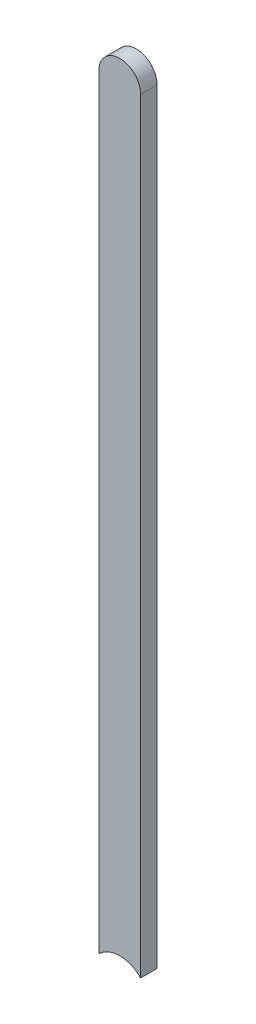
ISO-10303-21;
HEADER;
FILE_DESCRIPTION(('STEP AP214'),'2;1');
FILE_NAME('part.step','',(''),(''),'','','');
FILE_SCHEMA(('AUTOMOTIVE_DESIGN { 1 0 10303 214 1 1 1 1 }'));
ENDSEC;
DATA;
#1=APPLICATION_CONTEXT('core data for automotive mechanical design processes');
#2=APPLICATION_PROTOCOL_DEFINITION('international standard','automotive_design',2000,#1);
#3=PRODUCT_CONTEXT('',#1,'mechanical');
#4=PRODUCT('Part','Part','',(#3));
#5=PRODUCT_RELATED_PRODUCT_CATEGORY('part','',(#4));
#6=PRODUCT_DEFINITION_FORMATION('','',#4);
#7=PRODUCT_DEFINITION_CONTEXT('part definition',#1,'design');
#8=PRODUCT_DEFINITION('design','',#6,#7);
#9=PRODUCT_DEFINITION_SHAPE('','',#8);
#10=(LENGTH_UNIT() NAMED_UNIT(*) SI_UNIT(.MILLI.,.METRE.));
#11=(NAMED_UNIT(*) PLANE_ANGLE_UNIT() SI_UNIT($,.RADIAN.));
#12=(NAMED_UNIT(*) SI_UNIT($,.STERADIAN.) SOLID_ANGLE_UNIT());
#13=UNCERTAINTY_MEASURE_WITH_UNIT(LENGTH_MEASURE(1.E-05),#10,'distance_accuracy_value','');
#14=(GEOMETRIC_REPRESENTATION_CONTEXT(3) GLOBAL_UNCERTAINTY_ASSIGNED_CONTEXT((#13)) GLOBAL_UNIT_ASSIGNED_CONTEXT((#10,
#11,#12)) REPRESENTATION_CONTEXT('',''));
#15=CARTESIAN_POINT('',(0.,0.,0.));
#16=DIRECTION('',(0.,0.,1.));
#17=DIRECTION('',(1.,0.,0.));
#18=AXIS2_PLACEMENT_3D('',#15,#16,#17);
#19=CARTESIAN_POINT('',(118.5672,106.116068157867,0.));
#20=DIRECTION('',(-1.,0.,0.));
#21=DIRECTION('',(0.,1.,0.));
#22=AXIS2_PLACEMENT_3D('',#19,#20,#21);
#23=PLANE('',#22);
#24=DIRECTION('',(0.,1.,0.));
#25=VECTOR('',#24,1.);
#26=CARTESIAN_POINT('',(118.5672,105.8672,0.1999996));
#27=LINE('',#26,#25);
#28=CARTESIAN_POINT('',(118.5672,106.116068157867,0.1999996));
#29=VERTEX_POINT('',#28);
#30=CARTESIAN_POINT('',(118.5672,115.4176,0.1999996));
#31=VERTEX_POINT('',#30);
#32=EDGE_CURVE('E11',#29,#31,#27,.T.);
#33=ORIENTED_EDGE('',*,*,#32,.F.);
#34=DIRECTION('',(0.,0.,1.));
#35=VECTOR('',#34,1.);
#36=CARTESIAN_POINT('',(118.5672,106.116068157867,0.));
#37=LINE('',#36,#35);
#38=CARTESIAN_POINT('',(118.5672,106.116068157867,0.));
#39=VERTEX_POINT('',#38);
#40=EDGE_CURVE('E24',#39,#29,#37,.T.);
#41=ORIENTED_EDGE('',*,*,#40,.F.);
#42=DIRECTION('',(0.,1.,0.));
#43=VECTOR('',#42,1.);
#44=CARTESIAN_POINT('',(118.5672,105.8672,0.));
#45=LINE('',#44,#43);
#46=CARTESIAN_POINT('',(118.5672,115.4176,0.));
#47=VERTEX_POINT('',#46);
#48=EDGE_CURVE('E75',#39,#47,#45,.T.);
#49=ORIENTED_EDGE('',*,*,#48,.T.);
#50=DIRECTION('',(0.,0.,1.));
#51=VECTOR('',#50,1.);
#52=CARTESIAN_POINT('',(118.5672,115.4176,0.));
#53=LINE('',#52,#51);
#54=EDGE_CURVE('E37',#47,#31,#53,.T.);
#55=ORIENTED_EDGE('',*,*,#54,.T.);
#56=EDGE_LOOP('',(#33,#41,#49,#55));
#57=FACE_BOUND('',#56,.T.);
#58=ADVANCED_FACE('F17',(#57),#23,.F.);
#59=CARTESIAN_POINT('',(118.3132,115.4176,0.));
#60=DIRECTION('',(0.,0.,-1.));
#61=DIRECTION('',(1.,0.,0.));
#62=AXIS2_PLACEMENT_3D('',#59,#60,#61);
#63=CYLINDRICAL_SURFACE('',#62,0.253999999999995);
#64=CARTESIAN_POINT('',(118.3132,115.4176,0.1999996));
#65=DIRECTION('',(0.,0.,1.));
#66=DIRECTION('',(1.,0.,0.));
#67=AXIS2_PLACEMENT_3D('',#64,#65,#66);
#68=CIRCLE('',#67,0.253999999999995);
#69=CARTESIAN_POINT('',(118.0592,115.4176,0.1999996));
#70=VERTEX_POINT('',#69);
#71=EDGE_CURVE('E83',#31,#70,#68,.T.);
#72=ORIENTED_EDGE('',*,*,#71,.F.);
#73=ORIENTED_EDGE('',*,*,#54,.F.);
#74=CARTESIAN_POINT('',(118.3132,115.4176,0.));
#75=DIRECTION('',(0.,0.,1.));
#76=DIRECTION('',(1.,0.,0.));
#77=AXIS2_PLACEMENT_3D('',#74,#75,#76);
#78=CIRCLE('',#77,0.253999999999995);
#79=CARTESIAN_POINT('',(118.0592,115.4176,0.));
#80=VERTEX_POINT('',#79);
#81=EDGE_CURVE('E81',#47,#80,#78,.T.);
#82=ORIENTED_EDGE('',*,*,#81,.T.);
#83=DIRECTION('',(0.,0.,1.));
#84=VECTOR('',#83,1.);
#85=CARTESIAN_POINT('',(118.0592,115.4176,0.));
#86=LINE('',#85,#84);
#87=EDGE_CURVE('E67',#80,#70,#86,.T.);
#88=ORIENTED_EDGE('',*,*,#87,.T.);
#89=EDGE_LOOP('',(#72,#73,#82,#88));
#90=FACE_BOUND('',#89,.T.);
#91=ADVANCED_FACE('F89',(#90),#63,.T.);
#92=CARTESIAN_POINT('',(118.0592,115.4176,0.));
#93=DIRECTION('',(1.,0.,0.));
#94=DIRECTION('',(0.,-1.,0.));
#95=AXIS2_PLACEMENT_3D('',#92,#93,#94);
#96=PLANE('',#95);
#97=DIRECTION('',(0.,-1.,0.));
#98=VECTOR('',#97,1.);
#99=CARTESIAN_POINT('',(118.0592,115.4176,0.1999996));
#100=LINE('',#99,#98);
#101=CARTESIAN_POINT('',(118.0592,106.116068157867,0.1999996));
#102=VERTEX_POINT('',#101);
#103=EDGE_CURVE('E71',#70,#102,#100,.T.);
#104=ORIENTED_EDGE('',*,*,#103,.F.);
#105=ORIENTED_EDGE('',*,*,#87,.F.);
#106=DIRECTION('',(0.,-1.,0.));
#107=VECTOR('',#106,1.);
#108=CARTESIAN_POINT('',(118.0592,115.4176,0.));
#109=LINE('',#108,#107);
#110=CARTESIAN_POINT('',(118.0592,106.116068157867,0.));
#111=VERTEX_POINT('',#110);
#112=EDGE_CURVE('E63',#80,#111,#109,.T.);
#113=ORIENTED_EDGE('',*,*,#112,.T.);
#114=DIRECTION('',(0.,0.,1.));
#115=VECTOR('',#114,1.);
#116=CARTESIAN_POINT('',(118.0592,106.116068157867,0.));
#117=LINE('',#116,#115);
#118=EDGE_CURVE('E53',#111,#102,#117,.T.);
#119=ORIENTED_EDGE('',*,*,#118,.T.);
#120=EDGE_LOOP('',(#104,#105,#113,#119));
#121=FACE_BOUND('',#120,.T.);
#122=ADVANCED_FACE('F66',(#121),#96,.F.);
#123=CARTESIAN_POINT('',(118.3132,105.8672,0.));
#124=DIRECTION('',(0.,0.,-1.));
#125=DIRECTION('',(1.,0.,0.));
#126=AXIS2_PLACEMENT_3D('',#123,#124,#125);
#127=CYLINDRICAL_SURFACE('',#126,0.3556);
#128=ORIENTED_EDGE('',*,*,#40,.T.);
#129=CARTESIAN_POINT('',(118.3132,105.8672,0.1999996));
#130=DIRECTION('',(0.,0.,1.));
#131=DIRECTION('',(1.,0.,0.));
#132=AXIS2_PLACEMENT_3D('',#129,#130,#131);
#133=CIRCLE('',#132,0.3556);
#134=EDGE_CURVE('E59',#29,#102,#133,.T.);
#135=ORIENTED_EDGE('',*,*,#134,.T.);
#136=ORIENTED_EDGE('',*,*,#118,.F.);
#137=CARTESIAN_POINT('',(118.3132,105.8672,0.));
#138=DIRECTION('',(0.,0.,1.));
#139=DIRECTION('',(1.,0.,0.));
#140=AXIS2_PLACEMENT_3D('',#137,#138,#139);
#141=CIRCLE('',#140,0.3556);
#142=EDGE_CURVE('E57',#39,#111,#141,.T.);
#143=ORIENTED_EDGE('',*,*,#142,.F.);
#144=EDGE_LOOP('',(#128,#135,#136,#143));
#145=FACE_BOUND('',#144,.T.);
#146=ADVANCED_FACE('F55',(#145),#127,.F.);
#147=CARTESIAN_POINT('',(118.5672,105.8672,0.));
#148=DIRECTION('',(0.,0.,-1.));
#149=DIRECTION('',(-1.,0.,0.));
#150=AXIS2_PLACEMENT_3D('',#147,#148,#149);
#151=PLANE('',#150);
#152=ORIENTED_EDGE('',*,*,#48,.F.);
#153=ORIENTED_EDGE('',*,*,#142,.T.);
#154=ORIENTED_EDGE('',*,*,#112,.F.);
#155=ORIENTED_EDGE('',*,*,#81,.F.);
#156=EDGE_LOOP('',(#152,#153,#154,#155));
#157=FACE_BOUND('',#156,.T.);
#158=ADVANCED_FACE('F74',(#157),#151,.T.);
#159=CARTESIAN_POINT('',(118.5672,105.8672,0.1999996));
#160=DIRECTION('',(0.,0.,-1.));
#161=DIRECTION('',(-1.,0.,0.));
#162=AXIS2_PLACEMENT_3D('',#159,#160,#161);
#163=PLANE('',#162);
#164=ORIENTED_EDGE('',*,*,#134,.F.);
#165=ORIENTED_EDGE('',*,*,#32,.T.);
#166=ORIENTED_EDGE('',*,*,#71,.T.);
#167=ORIENTED_EDGE('',*,*,#103,.T.);
#168=EDGE_LOOP('',(#164,#165,#166,#167));
#169=FACE_BOUND('',#168,.T.);
#170=ADVANCED_FACE('F91',(#169),#163,.F.);
#171=CLOSED_SHELL('',(#58,#91,#122,#146,#158,#170));
#172=MANIFOLD_SOLID_BREP('B1',#171);
#173=ADVANCED_BREP_SHAPE_REPRESENTATION('',(#18,#172),#14);
#174=SHAPE_DEFINITION_REPRESENTATION(#9,#173);
ENDSEC;
END-ISO-10303-21;
